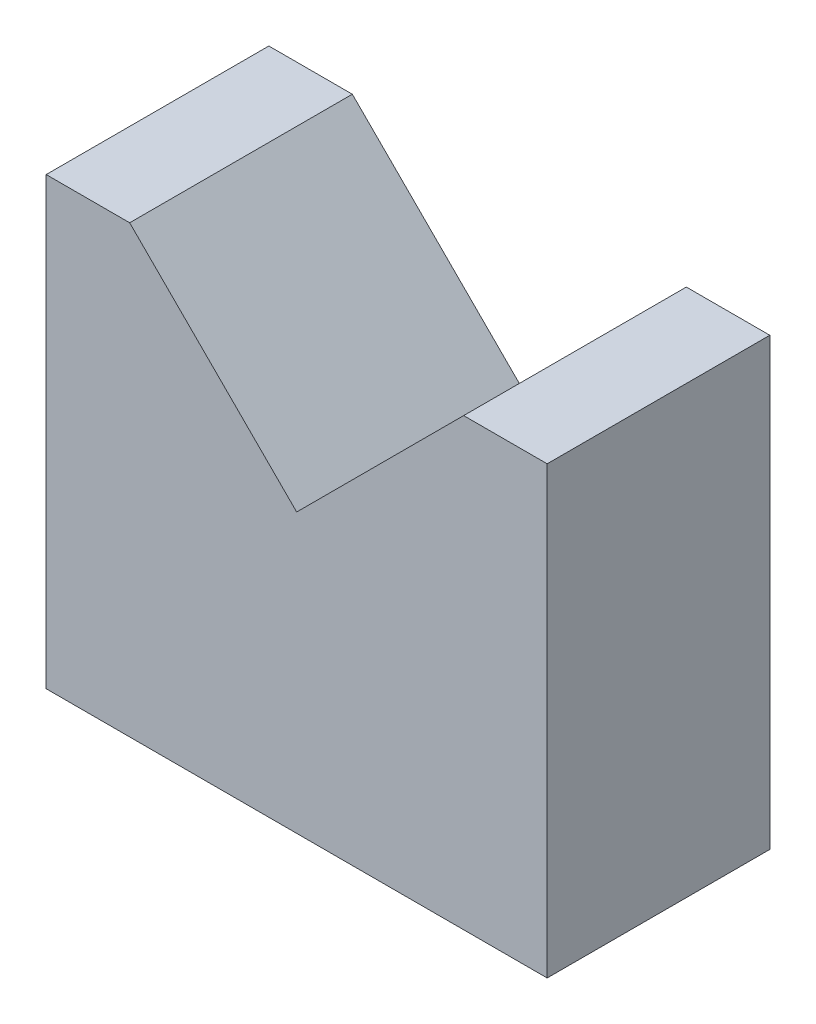
ISO-10303-21;
HEADER;
FILE_DESCRIPTION(('STEP AP214'),'2;1');
FILE_NAME('part.step','',(''),(''),'','','');
FILE_SCHEMA(('AUTOMOTIVE_DESIGN { 1 0 10303 214 1 1 1 1 }'));
ENDSEC;
DATA;
#1=APPLICATION_CONTEXT('core data for automotive mechanical design processes');
#2=APPLICATION_PROTOCOL_DEFINITION('international standard','automotive_design',2000,#1);
#3=PRODUCT_CONTEXT('',#1,'mechanical');
#4=PRODUCT('Part','Part','',(#3));
#5=PRODUCT_RELATED_PRODUCT_CATEGORY('part','',(#4));
#6=PRODUCT_DEFINITION_FORMATION('','',#4);
#7=PRODUCT_DEFINITION_CONTEXT('part definition',#1,'design');
#8=PRODUCT_DEFINITION('design','',#6,#7);
#9=PRODUCT_DEFINITION_SHAPE('','',#8);
#10=(LENGTH_UNIT() NAMED_UNIT(*) SI_UNIT(.MILLI.,.METRE.));
#11=(NAMED_UNIT(*) PLANE_ANGLE_UNIT() SI_UNIT($,.RADIAN.));
#12=(NAMED_UNIT(*) SI_UNIT($,.STERADIAN.) SOLID_ANGLE_UNIT());
#13=UNCERTAINTY_MEASURE_WITH_UNIT(LENGTH_MEASURE(1.E-05),#10,'distance_accuracy_value','');
#14=(GEOMETRIC_REPRESENTATION_CONTEXT(3) GLOBAL_UNCERTAINTY_ASSIGNED_CONTEXT((#13)) GLOBAL_UNIT_ASSIGNED_CONTEXT((#10,
#11,#12)) REPRESENTATION_CONTEXT('',''));
#15=CARTESIAN_POINT('',(0.,0.,0.));
#16=DIRECTION('',(0.,0.,1.));
#17=DIRECTION('',(1.,0.,0.));
#18=AXIS2_PLACEMENT_3D('',#15,#16,#17);
#19=CARTESIAN_POINT('',(-28.575,0.,12.7));
#20=DIRECTION('',(-1.,0.,0.));
#21=DIRECTION('',(0.,-1.,0.));
#22=AXIS2_PLACEMENT_3D('',#19,#20,#21);
#23=PLANE('',#22);
#24=DIRECTION('',(0.,1.,0.));
#25=VECTOR('',#24,1.);
#26=CARTESIAN_POINT('',(-28.575,0.,-12.7));
#27=LINE('',#26,#25);
#28=CARTESIAN_POINT('',(-28.575,0.,-12.7));
#29=VERTEX_POINT('',#28);
#30=CARTESIAN_POINT('',(-28.575,50.8,-12.7));
#31=VERTEX_POINT('',#30);
#32=EDGE_CURVE('E136',#29,#31,#27,.T.);
#33=ORIENTED_EDGE('',*,*,#32,.F.);
#34=DIRECTION('',(0.,0.,-1.));
#35=VECTOR('',#34,1.);
#36=CARTESIAN_POINT('',(-28.575,0.,12.7));
#37=LINE('',#36,#35);
#38=CARTESIAN_POINT('',(-28.575,0.,12.7));
#39=VERTEX_POINT('',#38);
#40=EDGE_CURVE('E11',#39,#29,#37,.T.);
#41=ORIENTED_EDGE('',*,*,#40,.F.);
#42=DIRECTION('',(0.,1.,0.));
#43=VECTOR('',#42,1.);
#44=CARTESIAN_POINT('',(-28.575,0.,12.7));
#45=LINE('',#44,#43);
#46=CARTESIAN_POINT('',(-28.575,50.8,12.7));
#47=VERTEX_POINT('',#46);
#48=EDGE_CURVE('E160',#39,#47,#45,.T.);
#49=ORIENTED_EDGE('',*,*,#48,.T.);
#50=DIRECTION('',(0.,0.,-1.));
#51=VECTOR('',#50,1.);
#52=CARTESIAN_POINT('',(-28.575,50.8,12.7));
#53=LINE('',#52,#51);
#54=EDGE_CURVE('E42',#47,#31,#53,.T.);
#55=ORIENTED_EDGE('',*,*,#54,.T.);
#56=EDGE_LOOP('',(#33,#41,#49,#55));
#57=FACE_BOUND('',#56,.T.);
#58=ADVANCED_FACE('F39',(#57),#23,.T.);
#59=CARTESIAN_POINT('',(28.575,0.,12.7));
#60=DIRECTION('',(0.,-1.,0.));
#61=DIRECTION('',(0.,0.,-1.));
#62=AXIS2_PLACEMENT_3D('',#59,#60,#61);
#63=PLANE('',#62);
#64=DIRECTION('',(-1.,0.,0.));
#65=VECTOR('',#64,1.);
#66=CARTESIAN_POINT('',(28.575,0.,-12.7));
#67=LINE('',#66,#65);
#68=CARTESIAN_POINT('',(28.575,0.,-12.7));
#69=VERTEX_POINT('',#68);
#70=EDGE_CURVE('E157',#69,#29,#67,.T.);
#71=ORIENTED_EDGE('',*,*,#70,.F.);
#72=DIRECTION('',(0.,0.,-1.));
#73=VECTOR('',#72,1.);
#74=CARTESIAN_POINT('',(28.575,0.,12.7));
#75=LINE('',#74,#73);
#76=CARTESIAN_POINT('',(28.575,0.,12.7));
#77=VERTEX_POINT('',#76);
#78=EDGE_CURVE('E49',#77,#69,#75,.T.);
#79=ORIENTED_EDGE('',*,*,#78,.F.);
#80=DIRECTION('',(-1.,0.,0.));
#81=VECTOR('',#80,1.);
#82=CARTESIAN_POINT('',(28.575,0.,12.7));
#83=LINE('',#82,#81);
#84=EDGE_CURVE('E122',#77,#39,#83,.T.);
#85=ORIENTED_EDGE('',*,*,#84,.T.);
#86=ORIENTED_EDGE('',*,*,#40,.T.);
#87=EDGE_LOOP('',(#71,#79,#85,#86));
#88=FACE_BOUND('',#87,.T.);
#89=ADVANCED_FACE('F175',(#88),#63,.T.);
#90=CARTESIAN_POINT('',(28.575,50.8,12.7));
#91=DIRECTION('',(1.,0.,0.));
#92=DIRECTION('',(0.,1.,0.));
#93=AXIS2_PLACEMENT_3D('',#90,#91,#92);
#94=PLANE('',#93);
#95=DIRECTION('',(0.,-1.,0.));
#96=VECTOR('',#95,1.);
#97=CARTESIAN_POINT('',(28.575,50.8,-12.7));
#98=LINE('',#97,#96);
#99=CARTESIAN_POINT('',(28.575,50.8,-12.7));
#100=VERTEX_POINT('',#99);
#101=EDGE_CURVE('E108',#100,#69,#98,.T.);
#102=ORIENTED_EDGE('',*,*,#101,.F.);
#103=DIRECTION('',(0.,0.,-1.));
#104=VECTOR('',#103,1.);
#105=CARTESIAN_POINT('',(28.575,50.8,12.7));
#106=LINE('',#105,#104);
#107=CARTESIAN_POINT('',(28.575,50.8,12.7));
#108=VERTEX_POINT('',#107);
#109=EDGE_CURVE('E103',#108,#100,#106,.T.);
#110=ORIENTED_EDGE('',*,*,#109,.F.);
#111=DIRECTION('',(0.,-1.,0.));
#112=VECTOR('',#111,1.);
#113=CARTESIAN_POINT('',(28.575,50.8,12.7));
#114=LINE('',#113,#112);
#115=EDGE_CURVE('E106',#108,#77,#114,.T.);
#116=ORIENTED_EDGE('',*,*,#115,.T.);
#117=ORIENTED_EDGE('',*,*,#78,.T.);
#118=EDGE_LOOP('',(#102,#110,#116,#117));
#119=FACE_BOUND('',#118,.T.);
#120=ADVANCED_FACE('F105',(#119),#94,.T.);
#121=CARTESIAN_POINT('',(19.0499999999999,50.8,12.7));
#122=DIRECTION('',(0.,1.,0.));
#123=DIRECTION('',(-1.,0.,0.));
#124=AXIS2_PLACEMENT_3D('',#121,#122,#123);
#125=PLANE('',#124);
#126=DIRECTION('',(1.,0.,0.));
#127=VECTOR('',#126,1.);
#128=CARTESIAN_POINT('',(19.0499999999999,50.8,-12.7));
#129=LINE('',#128,#127);
#130=CARTESIAN_POINT('',(19.0499999999999,50.8,-12.7));
#131=VERTEX_POINT('',#130);
#132=EDGE_CURVE('E152',#131,#100,#129,.T.);
#133=ORIENTED_EDGE('',*,*,#132,.F.);
#134=DIRECTION('',(0.,0.,-1.));
#135=VECTOR('',#134,1.);
#136=CARTESIAN_POINT('',(19.0499999999999,50.8,12.7));
#137=LINE('',#136,#135);
#138=CARTESIAN_POINT('',(19.0499999999999,50.8,12.7));
#139=VERTEX_POINT('',#138);
#140=EDGE_CURVE('E114',#139,#131,#137,.T.);
#141=ORIENTED_EDGE('',*,*,#140,.F.);
#142=DIRECTION('',(1.,0.,0.));
#143=VECTOR('',#142,1.);
#144=CARTESIAN_POINT('',(19.0499999999999,50.8,12.7));
#145=LINE('',#144,#143);
#146=EDGE_CURVE('E120',#139,#108,#145,.T.);
#147=ORIENTED_EDGE('',*,*,#146,.T.);
#148=ORIENTED_EDGE('',*,*,#109,.T.);
#149=EDGE_LOOP('',(#133,#141,#147,#148));
#150=FACE_BOUND('',#149,.T.);
#151=ADVANCED_FACE('F125',(#150),#125,.T.);
#152=CARTESIAN_POINT('',(0.,31.75,12.7));
#153=DIRECTION('',(-0.707106781186549,0.707106781186546,0.));
#154=DIRECTION('',(-0.707106781186546,-0.707106781186549,0.));
#155=AXIS2_PLACEMENT_3D('',#152,#153,#154);
#156=PLANE('',#155);
#157=DIRECTION('',(0.707106781186546,0.707106781186549,0.));
#158=VECTOR('',#157,1.);
#159=CARTESIAN_POINT('',(0.,31.75,-12.7));
#160=LINE('',#159,#158);
#161=CARTESIAN_POINT('',(0.,31.75,-12.7));
#162=VERTEX_POINT('',#161);
#163=EDGE_CURVE('E148',#162,#131,#160,.T.);
#164=ORIENTED_EDGE('',*,*,#163,.F.);
#165=DIRECTION('',(0.,0.,-1.));
#166=VECTOR('',#165,1.);
#167=CARTESIAN_POINT('',(0.,31.75,12.7));
#168=LINE('',#167,#166);
#169=CARTESIAN_POINT('',(0.,31.75,12.7));
#170=VERTEX_POINT('',#169);
#171=EDGE_CURVE('E166',#170,#162,#168,.T.);
#172=ORIENTED_EDGE('',*,*,#171,.F.);
#173=DIRECTION('',(0.707106781186546,0.707106781186549,0.));
#174=VECTOR('',#173,1.);
#175=CARTESIAN_POINT('',(0.,31.75,12.7));
#176=LINE('',#175,#174);
#177=EDGE_CURVE('E127',#170,#139,#176,.T.);
#178=ORIENTED_EDGE('',*,*,#177,.T.);
#179=ORIENTED_EDGE('',*,*,#140,.T.);
#180=EDGE_LOOP('',(#164,#172,#178,#179));
#181=FACE_BOUND('',#180,.T.);
#182=ADVANCED_FACE('F188',(#181),#156,.T.);
#183=CARTESIAN_POINT('',(-19.0499999999999,50.8,12.7));
#184=DIRECTION('',(0.707106781186549,0.707106781186546,0.));
#185=DIRECTION('',(-0.707106781186546,0.707106781186549,0.));
#186=AXIS2_PLACEMENT_3D('',#183,#184,#185);
#187=PLANE('',#186);
#188=DIRECTION('',(0.707106781186546,-0.707106781186549,0.));
#189=VECTOR('',#188,1.);
#190=CARTESIAN_POINT('',(-19.0499999999999,50.8,-12.7));
#191=LINE('',#190,#189);
#192=CARTESIAN_POINT('',(-19.0499999999999,50.8,-12.7));
#193=VERTEX_POINT('',#192);
#194=EDGE_CURVE('E144',#193,#162,#191,.T.);
#195=ORIENTED_EDGE('',*,*,#194,.F.);
#196=DIRECTION('',(0.,0.,-1.));
#197=VECTOR('',#196,1.);
#198=CARTESIAN_POINT('',(-19.0499999999999,50.8,12.7));
#199=LINE('',#198,#197);
#200=CARTESIAN_POINT('',(-19.0499999999999,50.8,12.7));
#201=VERTEX_POINT('',#200);
#202=EDGE_CURVE('E168',#201,#193,#199,.T.);
#203=ORIENTED_EDGE('',*,*,#202,.F.);
#204=DIRECTION('',(0.707106781186546,-0.707106781186549,0.));
#205=VECTOR('',#204,1.);
#206=CARTESIAN_POINT('',(-19.0499999999999,50.8,12.7));
#207=LINE('',#206,#205);
#208=EDGE_CURVE('E130',#201,#170,#207,.T.);
#209=ORIENTED_EDGE('',*,*,#208,.T.);
#210=ORIENTED_EDGE('',*,*,#171,.T.);
#211=EDGE_LOOP('',(#195,#203,#209,#210));
#212=FACE_BOUND('',#211,.T.);
#213=ADVANCED_FACE('F191',(#212),#187,.T.);
#214=CARTESIAN_POINT('',(-28.575,50.8,12.7));
#215=DIRECTION('',(0.,1.,0.));
#216=DIRECTION('',(-1.,0.,0.));
#217=AXIS2_PLACEMENT_3D('',#214,#215,#216);
#218=PLANE('',#217);
#219=DIRECTION('',(1.,0.,0.));
#220=VECTOR('',#219,1.);
#221=CARTESIAN_POINT('',(-28.575,50.8,-12.7));
#222=LINE('',#221,#220);
#223=EDGE_CURVE('E140',#31,#193,#222,.T.);
#224=ORIENTED_EDGE('',*,*,#223,.F.);
#225=ORIENTED_EDGE('',*,*,#54,.F.);
#226=DIRECTION('',(1.,0.,0.));
#227=VECTOR('',#226,1.);
#228=CARTESIAN_POINT('',(-28.575,50.8,12.7));
#229=LINE('',#228,#227);
#230=EDGE_CURVE('E254',#47,#201,#229,.T.);
#231=ORIENTED_EDGE('',*,*,#230,.T.);
#232=ORIENTED_EDGE('',*,*,#202,.T.);
#233=EDGE_LOOP('',(#224,#225,#231,#232));
#234=FACE_BOUND('',#233,.T.);
#235=ADVANCED_FACE('F172',(#234),#218,.T.);
#236=CARTESIAN_POINT('',(0.,0.,12.7));
#237=DIRECTION('',(0.,0.,-1.));
#238=DIRECTION('',(-1.,0.,0.));
#239=AXIS2_PLACEMENT_3D('',#236,#237,#238);
#240=PLANE('',#239);
#241=ORIENTED_EDGE('',*,*,#48,.F.);
#242=ORIENTED_EDGE('',*,*,#84,.F.);
#243=ORIENTED_EDGE('',*,*,#115,.F.);
#244=ORIENTED_EDGE('',*,*,#146,.F.);
#245=ORIENTED_EDGE('',*,*,#177,.F.);
#246=ORIENTED_EDGE('',*,*,#208,.F.);
#247=ORIENTED_EDGE('',*,*,#230,.F.);
#248=EDGE_LOOP('',(#241,#242,#243,#244,#245,#246,#247));
#249=FACE_BOUND('',#248,.T.);
#250=ADVANCED_FACE('F118',(#249),#240,.F.);
#251=CARTESIAN_POINT('',(0.,0.,-12.7));
#252=DIRECTION('',(0.,0.,-1.));
#253=DIRECTION('',(-1.,0.,0.));
#254=AXIS2_PLACEMENT_3D('',#251,#252,#253);
#255=PLANE('',#254);
#256=ORIENTED_EDGE('',*,*,#32,.T.);
#257=ORIENTED_EDGE('',*,*,#223,.T.);
#258=ORIENTED_EDGE('',*,*,#194,.T.);
#259=ORIENTED_EDGE('',*,*,#163,.T.);
#260=ORIENTED_EDGE('',*,*,#132,.T.);
#261=ORIENTED_EDGE('',*,*,#101,.T.);
#262=ORIENTED_EDGE('',*,*,#70,.T.);
#263=EDGE_LOOP('',(#256,#257,#258,#259,#260,#261,#262));
#264=FACE_BOUND('',#263,.T.);
#265=ADVANCED_FACE('F174',(#264),#255,.T.);
#266=CLOSED_SHELL('',(#58,#89,#120,#151,#182,#213,#235,#250,#265));
#267=MANIFOLD_SOLID_BREP('B2',#266);
#268=ADVANCED_BREP_SHAPE_REPRESENTATION('',(#18,#267),#14);
#269=SHAPE_DEFINITION_REPRESENTATION(#9,#268);
ENDSEC;
END-ISO-10303-21;
